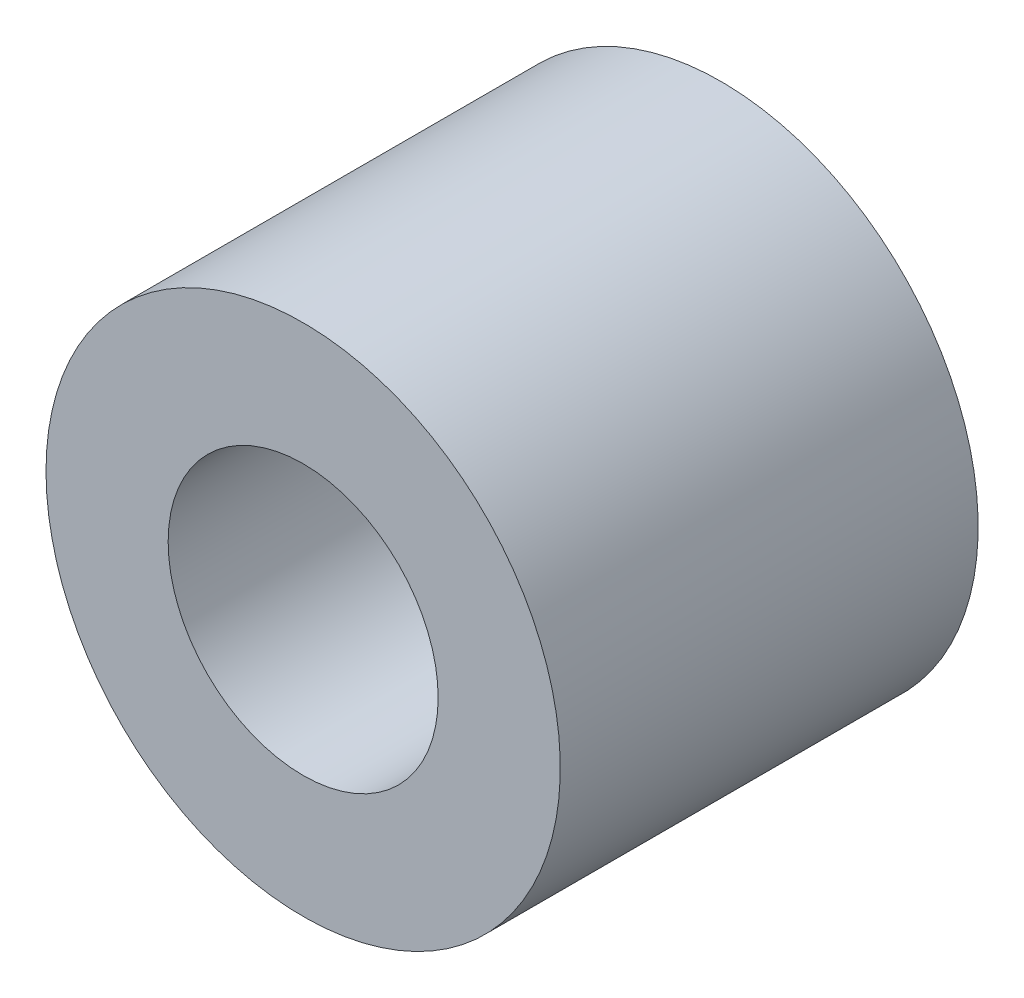
ISO-10303-21;
HEADER;
FILE_DESCRIPTION(('STEP AP214'),'2;1');
FILE_NAME('part.step','',(''),(''),'','','');
FILE_SCHEMA(('AUTOMOTIVE_DESIGN { 1 0 10303 214 1 1 1 1 }'));
ENDSEC;
DATA;
#1=APPLICATION_CONTEXT('core data for automotive mechanical design processes');
#2=APPLICATION_PROTOCOL_DEFINITION('international standard','automotive_design',2000,#1);
#3=PRODUCT_CONTEXT('',#1,'mechanical');
#4=PRODUCT('Part','Part','',(#3));
#5=PRODUCT_RELATED_PRODUCT_CATEGORY('part','',(#4));
#6=PRODUCT_DEFINITION_FORMATION('','',#4);
#7=PRODUCT_DEFINITION_CONTEXT('part definition',#1,'design');
#8=PRODUCT_DEFINITION('design','',#6,#7);
#9=PRODUCT_DEFINITION_SHAPE('','',#8);
#10=(LENGTH_UNIT() NAMED_UNIT(*) SI_UNIT(.MILLI.,.METRE.));
#11=(NAMED_UNIT(*) PLANE_ANGLE_UNIT() SI_UNIT($,.RADIAN.));
#12=(NAMED_UNIT(*) SI_UNIT($,.STERADIAN.) SOLID_ANGLE_UNIT());
#13=UNCERTAINTY_MEASURE_WITH_UNIT(LENGTH_MEASURE(1.E-05),#10,'distance_accuracy_value','');
#14=(GEOMETRIC_REPRESENTATION_CONTEXT(3) GLOBAL_UNCERTAINTY_ASSIGNED_CONTEXT((#13)) GLOBAL_UNIT_ASSIGNED_CONTEXT((#10,
#11,#12)) REPRESENTATION_CONTEXT('',''));
#15=CARTESIAN_POINT('',(0.,0.,0.));
#16=DIRECTION('',(0.,0.,1.));
#17=DIRECTION('',(1.,0.,0.));
#18=AXIS2_PLACEMENT_3D('',#15,#16,#17);
#19=CARTESIAN_POINT('',(0.,0.,6.5));
#20=DIRECTION('',(0.,0.,1.));
#21=DIRECTION('',(1.,0.,0.));
#22=AXIS2_PLACEMENT_3D('',#19,#20,#21);
#23=PLANE('',#22);
#24=CARTESIAN_POINT('',(0.,0.,6.5));
#25=DIRECTION('',(0.,0.,1.));
#26=DIRECTION('',(1.,0.,0.));
#27=AXIS2_PLACEMENT_3D('',#24,#25,#26);
#28=CIRCLE('',#27,4.);
#29=CARTESIAN_POINT('',(-4.,0.,6.5));
#30=VERTEX_POINT('',#29);
#31=EDGE_CURVE('E10',#30,#30,#28,.T.);
#32=ORIENTED_EDGE('',*,*,#31,.T.);
#33=EDGE_LOOP('',(#32));
#34=FACE_BOUND('',#33,.T.);
#35=CARTESIAN_POINT('',(0.,0.,6.5));
#36=DIRECTION('',(0.,0.,1.));
#37=DIRECTION('',(1.,0.,0.));
#38=AXIS2_PLACEMENT_3D('',#35,#36,#37);
#39=CIRCLE('',#38,2.1);
#40=CARTESIAN_POINT('',(-2.1,0.,6.5));
#41=VERTEX_POINT('',#40);
#42=EDGE_CURVE('E42',#41,#41,#39,.T.);
#43=ORIENTED_EDGE('',*,*,#42,.F.);
#44=EDGE_LOOP('',(#43));
#45=FACE_BOUND('',#44,.T.);
#46=ADVANCED_FACE('F31',(#34,#45),#23,.T.);
#47=CARTESIAN_POINT('',(0.,0.,0.));
#48=DIRECTION('',(0.,0.,1.));
#49=DIRECTION('',(1.,0.,0.));
#50=AXIS2_PLACEMENT_3D('',#47,#48,#49);
#51=PLANE('',#50);
#52=CARTESIAN_POINT('',(0.,0.,0.));
#53=DIRECTION('',(0.,0.,1.));
#54=DIRECTION('',(1.,0.,0.));
#55=AXIS2_PLACEMENT_3D('',#52,#53,#54);
#56=CIRCLE('',#55,4.);
#57=CARTESIAN_POINT('',(-4.,0.,0.));
#58=VERTEX_POINT('',#57);
#59=EDGE_CURVE('E35',#58,#58,#56,.T.);
#60=ORIENTED_EDGE('',*,*,#59,.F.);
#61=EDGE_LOOP('',(#60));
#62=FACE_BOUND('',#61,.T.);
#63=CARTESIAN_POINT('',(0.,0.,0.));
#64=DIRECTION('',(0.,0.,1.));
#65=DIRECTION('',(1.,0.,0.));
#66=AXIS2_PLACEMENT_3D('',#63,#64,#65);
#67=CIRCLE('',#66,2.1);
#68=CARTESIAN_POINT('',(-2.1,0.,0.));
#69=VERTEX_POINT('',#68);
#70=EDGE_CURVE('E44',#69,#69,#67,.T.);
#71=ORIENTED_EDGE('',*,*,#70,.T.);
#72=EDGE_LOOP('',(#71));
#73=FACE_BOUND('',#72,.T.);
#74=ADVANCED_FACE('F54',(#62,#73),#51,.F.);
#75=CARTESIAN_POINT('',(0.,0.,6.5));
#76=DIRECTION('',(0.,0.,-1.));
#77=DIRECTION('',(-1.,0.,0.));
#78=AXIS2_PLACEMENT_3D('',#75,#76,#77);
#79=CYLINDRICAL_SURFACE('',#78,4.);
#80=CARTESIAN_POINT('',(-4.,0.,6.5));
#81=CARTESIAN_POINT('',(-4.,0.,6.43229166666667));
#82=CARTESIAN_POINT('',(-4.,0.,6.36458333333333));
#83=CARTESIAN_POINT('',(-4.,0.,6.22916666666667));
#84=CARTESIAN_POINT('',(-4.,0.,6.16145833333333));
#85=CARTESIAN_POINT('',(-4.,0.,6.02604166666667));
#86=CARTESIAN_POINT('',(-4.,0.,5.95833333333333));
#87=CARTESIAN_POINT('',(-4.,0.,5.82291666666667));
#88=CARTESIAN_POINT('',(-4.,0.,5.75520833333333));
#89=CARTESIAN_POINT('',(-4.,0.,5.61979166666667));
#90=CARTESIAN_POINT('',(-4.,0.,5.55208333333333));
#91=CARTESIAN_POINT('',(-4.,0.,5.41666666666667));
#92=CARTESIAN_POINT('',(-4.,0.,5.34895833333333));
#93=CARTESIAN_POINT('',(-4.,0.,5.21354166666667));
#94=CARTESIAN_POINT('',(-4.,0.,5.14583333333333));
#95=CARTESIAN_POINT('',(-4.,0.,5.01041666666667));
#96=CARTESIAN_POINT('',(-4.,0.,4.94270833333333));
#97=CARTESIAN_POINT('',(-4.,0.,4.80729166666667));
#98=CARTESIAN_POINT('',(-4.,0.,4.73958333333333));
#99=CARTESIAN_POINT('',(-4.,0.,4.60416666666667));
#100=CARTESIAN_POINT('',(-4.,0.,4.53645833333333));
#101=CARTESIAN_POINT('',(-4.,0.,4.40104166666667));
#102=CARTESIAN_POINT('',(-4.,0.,4.33333333333333));
#103=CARTESIAN_POINT('',(-4.,0.,4.19791666666667));
#104=CARTESIAN_POINT('',(-4.,0.,4.13020833333333));
#105=CARTESIAN_POINT('',(-4.,0.,3.99479166666667));
#106=CARTESIAN_POINT('',(-4.,0.,3.92708333333333));
#107=CARTESIAN_POINT('',(-4.,0.,3.79166666666667));
#108=CARTESIAN_POINT('',(-4.,0.,3.72395833333333));
#109=CARTESIAN_POINT('',(-4.,0.,3.58854166666667));
#110=CARTESIAN_POINT('',(-4.,0.,3.52083333333333));
#111=CARTESIAN_POINT('',(-4.,0.,3.38541666666667));
#112=CARTESIAN_POINT('',(-4.,0.,3.31770833333333));
#113=CARTESIAN_POINT('',(-4.,0.,3.18229166666667));
#114=CARTESIAN_POINT('',(-4.,0.,3.11458333333333));
#115=CARTESIAN_POINT('',(-4.,0.,2.97916666666667));
#116=CARTESIAN_POINT('',(-4.,0.,2.91145833333333));
#117=CARTESIAN_POINT('',(-4.,0.,2.77604166666667));
#118=CARTESIAN_POINT('',(-4.,0.,2.70833333333333));
#119=CARTESIAN_POINT('',(-4.,0.,2.57291666666667));
#120=CARTESIAN_POINT('',(-4.,0.,2.50520833333333));
#121=CARTESIAN_POINT('',(-4.,0.,2.36979166666667));
#122=CARTESIAN_POINT('',(-4.,0.,2.30208333333333));
#123=CARTESIAN_POINT('',(-4.,0.,2.16666666666667));
#124=CARTESIAN_POINT('',(-4.,0.,2.09895833333333));
#125=CARTESIAN_POINT('',(-4.,0.,1.96354166666667));
#126=CARTESIAN_POINT('',(-4.,0.,1.89583333333333));
#127=CARTESIAN_POINT('',(-4.,0.,1.76041666666667));
#128=CARTESIAN_POINT('',(-4.,0.,1.69270833333333));
#129=CARTESIAN_POINT('',(-4.,0.,1.55729166666667));
#130=CARTESIAN_POINT('',(-4.,0.,1.48958333333333));
#131=CARTESIAN_POINT('',(-4.,0.,1.35416666666667));
#132=CARTESIAN_POINT('',(-4.,0.,1.28645833333333));
#133=CARTESIAN_POINT('',(-4.,0.,1.15104166666667));
#134=CARTESIAN_POINT('',(-4.,0.,1.08333333333333));
#135=CARTESIAN_POINT('',(-4.,0.,0.947916666666667));
#136=CARTESIAN_POINT('',(-4.,0.,0.880208333333333));
#137=CARTESIAN_POINT('',(-4.,0.,0.744791666666667));
#138=CARTESIAN_POINT('',(-4.,0.,0.677083333333333));
#139=CARTESIAN_POINT('',(-4.,0.,0.541666666666667));
#140=CARTESIAN_POINT('',(-4.,0.,0.473958333333333));
#141=CARTESIAN_POINT('',(-4.,0.,0.338541666666667));
#142=CARTESIAN_POINT('',(-4.,0.,0.270833333333334));
#143=CARTESIAN_POINT('',(-4.,0.,0.135416666666667));
#144=CARTESIAN_POINT('',(-4.,0.,0.0677083333333334));
#145=CARTESIAN_POINT('',(-4.,0.,0.));
#146=B_SPLINE_CURVE_WITH_KNOTS('',3,(#80,#81,#82,#83,#84,#85,#86,#87,#88,#89,#90,#91,#92,#93,
#94,#95,#96,#97,#98,#99,#100,#101,#102,#103,#104,#105,#106,#107,#108,#109,#110,#111,#112,#113,
#114,#115,#116,#117,#118,#119,#120,#121,#122,#123,#124,#125,#126,#127,#128,#129,#130,#131,#132,
#133,#134,#135,#136,#137,#138,#139,#140,#141,#142,#143,#144,#145),.UNSPECIFIED.,.F.,.F.,(4,2,2,
2,2,2,2,2,2,2,2,2,2,2,2,2,2,2,2,2,2,2,2,2,2,2,2,2,2,2,2,2,4),(0.,0.203125,0.40625,
0.609375000000001,0.812500000000001,1.015625,1.21875,1.421875,1.625,1.828125,2.03125,2.234375,
2.4375,2.640625,2.84375,3.046875,3.25,3.453125,3.65625,3.859375,4.0625,4.265625,4.46875,
4.671875,4.875,5.078125,5.28125,5.484375,5.6875,5.890625,6.09375,6.296875,6.5),.UNSPECIFIED.);
#147=EDGE_CURVE('BSEAM33',#30,#58,#146,.T.);
#148=ORIENTED_EDGE('',*,*,#31,.F.);
#149=ORIENTED_EDGE('',*,*,#59,.T.);
#150=ORIENTED_EDGE('',*,*,#147,.T.);
#151=ORIENTED_EDGE('',*,*,#147,.F.);
#152=EDGE_LOOP('',(#148,#150,#149,#151));
#153=FACE_BOUND('',#152,.T.);
#154=ADVANCED_FACE('F33',(#153),#79,.T.);
#155=CARTESIAN_POINT('',(0.,0.,6.5));
#156=DIRECTION('',(0.,0.,-1.));
#157=DIRECTION('',(-1.,0.,0.));
#158=AXIS2_PLACEMENT_3D('',#155,#156,#157);
#159=CYLINDRICAL_SURFACE('',#158,2.1);
#160=CARTESIAN_POINT('',(-2.1,0.,6.5));
#161=CARTESIAN_POINT('',(-2.1,0.,6.43229166666667));
#162=CARTESIAN_POINT('',(-2.1,0.,6.36458333333333));
#163=CARTESIAN_POINT('',(-2.1,0.,6.22916666666667));
#164=CARTESIAN_POINT('',(-2.1,0.,6.16145833333333));
#165=CARTESIAN_POINT('',(-2.1,0.,6.02604166666667));
#166=CARTESIAN_POINT('',(-2.1,0.,5.95833333333333));
#167=CARTESIAN_POINT('',(-2.1,0.,5.82291666666667));
#168=CARTESIAN_POINT('',(-2.1,0.,5.75520833333333));
#169=CARTESIAN_POINT('',(-2.1,0.,5.61979166666667));
#170=CARTESIAN_POINT('',(-2.1,0.,5.55208333333333));
#171=CARTESIAN_POINT('',(-2.1,0.,5.41666666666667));
#172=CARTESIAN_POINT('',(-2.1,0.,5.34895833333333));
#173=CARTESIAN_POINT('',(-2.1,0.,5.21354166666667));
#174=CARTESIAN_POINT('',(-2.1,0.,5.14583333333333));
#175=CARTESIAN_POINT('',(-2.1,0.,5.01041666666667));
#176=CARTESIAN_POINT('',(-2.1,0.,4.94270833333333));
#177=CARTESIAN_POINT('',(-2.1,0.,4.80729166666667));
#178=CARTESIAN_POINT('',(-2.1,0.,4.73958333333333));
#179=CARTESIAN_POINT('',(-2.1,0.,4.60416666666667));
#180=CARTESIAN_POINT('',(-2.1,0.,4.53645833333333));
#181=CARTESIAN_POINT('',(-2.1,0.,4.40104166666667));
#182=CARTESIAN_POINT('',(-2.1,0.,4.33333333333333));
#183=CARTESIAN_POINT('',(-2.1,0.,4.19791666666667));
#184=CARTESIAN_POINT('',(-2.1,0.,4.13020833333333));
#185=CARTESIAN_POINT('',(-2.1,0.,3.99479166666667));
#186=CARTESIAN_POINT('',(-2.1,0.,3.92708333333333));
#187=CARTESIAN_POINT('',(-2.1,0.,3.79166666666667));
#188=CARTESIAN_POINT('',(-2.1,0.,3.72395833333333));
#189=CARTESIAN_POINT('',(-2.1,0.,3.58854166666667));
#190=CARTESIAN_POINT('',(-2.1,0.,3.52083333333333));
#191=CARTESIAN_POINT('',(-2.1,0.,3.38541666666667));
#192=CARTESIAN_POINT('',(-2.1,0.,3.31770833333333));
#193=CARTESIAN_POINT('',(-2.1,0.,3.18229166666667));
#194=CARTESIAN_POINT('',(-2.1,0.,3.11458333333333));
#195=CARTESIAN_POINT('',(-2.1,0.,2.97916666666667));
#196=CARTESIAN_POINT('',(-2.1,0.,2.91145833333333));
#197=CARTESIAN_POINT('',(-2.1,0.,2.77604166666667));
#198=CARTESIAN_POINT('',(-2.1,0.,2.70833333333333));
#199=CARTESIAN_POINT('',(-2.1,0.,2.57291666666667));
#200=CARTESIAN_POINT('',(-2.1,0.,2.50520833333333));
#201=CARTESIAN_POINT('',(-2.1,0.,2.36979166666667));
#202=CARTESIAN_POINT('',(-2.1,0.,2.30208333333333));
#203=CARTESIAN_POINT('',(-2.1,0.,2.16666666666667));
#204=CARTESIAN_POINT('',(-2.1,0.,2.09895833333333));
#205=CARTESIAN_POINT('',(-2.1,0.,1.96354166666667));
#206=CARTESIAN_POINT('',(-2.1,0.,1.89583333333333));
#207=CARTESIAN_POINT('',(-2.1,0.,1.76041666666667));
#208=CARTESIAN_POINT('',(-2.1,0.,1.69270833333333));
#209=CARTESIAN_POINT('',(-2.1,0.,1.55729166666667));
#210=CARTESIAN_POINT('',(-2.1,0.,1.48958333333333));
#211=CARTESIAN_POINT('',(-2.1,0.,1.35416666666667));
#212=CARTESIAN_POINT('',(-2.1,0.,1.28645833333333));
#213=CARTESIAN_POINT('',(-2.1,0.,1.15104166666667));
#214=CARTESIAN_POINT('',(-2.1,0.,1.08333333333333));
#215=CARTESIAN_POINT('',(-2.1,0.,0.947916666666667));
#216=CARTESIAN_POINT('',(-2.1,0.,0.880208333333333));
#217=CARTESIAN_POINT('',(-2.1,0.,0.744791666666667));
#218=CARTESIAN_POINT('',(-2.1,0.,0.677083333333333));
#219=CARTESIAN_POINT('',(-2.1,0.,0.541666666666667));
#220=CARTESIAN_POINT('',(-2.1,0.,0.473958333333333));
#221=CARTESIAN_POINT('',(-2.1,0.,0.338541666666667));
#222=CARTESIAN_POINT('',(-2.1,0.,0.270833333333334));
#223=CARTESIAN_POINT('',(-2.1,0.,0.135416666666667));
#224=CARTESIAN_POINT('',(-2.1,0.,0.0677083333333334));
#225=CARTESIAN_POINT('',(-2.1,0.,0.));
#226=B_SPLINE_CURVE_WITH_KNOTS('',3,(#160,#161,#162,#163,#164,#165,#166,#167,#168,#169,#170,
#171,#172,#173,#174,#175,#176,#177,#178,#179,#180,#181,#182,#183,#184,#185,#186,#187,#188,#189,
#190,#191,#192,#193,#194,#195,#196,#197,#198,#199,#200,#201,#202,#203,#204,#205,#206,#207,#208,
#209,#210,#211,#212,#213,#214,#215,#216,#217,#218,#219,#220,#221,#222,#223,#224,#225),
.UNSPECIFIED.,.F.,.F.,(4,2,2,2,2,2,2,2,2,2,2,2,2,2,2,2,2,2,2,2,2,2,2,2,2,2,2,2,2,2,2,2,4),(0.,
0.203125,0.40625,0.609375000000001,0.812500000000001,1.015625,1.21875,1.421875,1.625,1.828125,
2.03125,2.234375,2.4375,2.640625,2.84375,3.046875,3.25,3.453125,3.65625,3.859375,4.0625,
4.265625,4.46875,4.671875,4.875,5.078125,5.28125,5.484375,5.6875,5.890625,6.09375,6.296875,6.5),.UNSPECIFIED.);
#227=EDGE_CURVE('BSEAM50',#41,#69,#226,.T.);
#228=ORIENTED_EDGE('',*,*,#42,.T.);
#229=ORIENTED_EDGE('',*,*,#70,.F.);
#230=ORIENTED_EDGE('',*,*,#227,.T.);
#231=ORIENTED_EDGE('',*,*,#227,.F.);
#232=EDGE_LOOP('',(#228,#230,#229,#231));
#233=FACE_BOUND('',#232,.T.);
#234=ADVANCED_FACE('F50',(#233),#159,.F.);
#235=CLOSED_SHELL('',(#46,#74,#154,#234));
#236=MANIFOLD_SOLID_BREP('B2',#235);
#237=ADVANCED_BREP_SHAPE_REPRESENTATION('',(#18,#236),#14);
#238=SHAPE_DEFINITION_REPRESENTATION(#9,#237);
ENDSEC;
END-ISO-10303-21;
